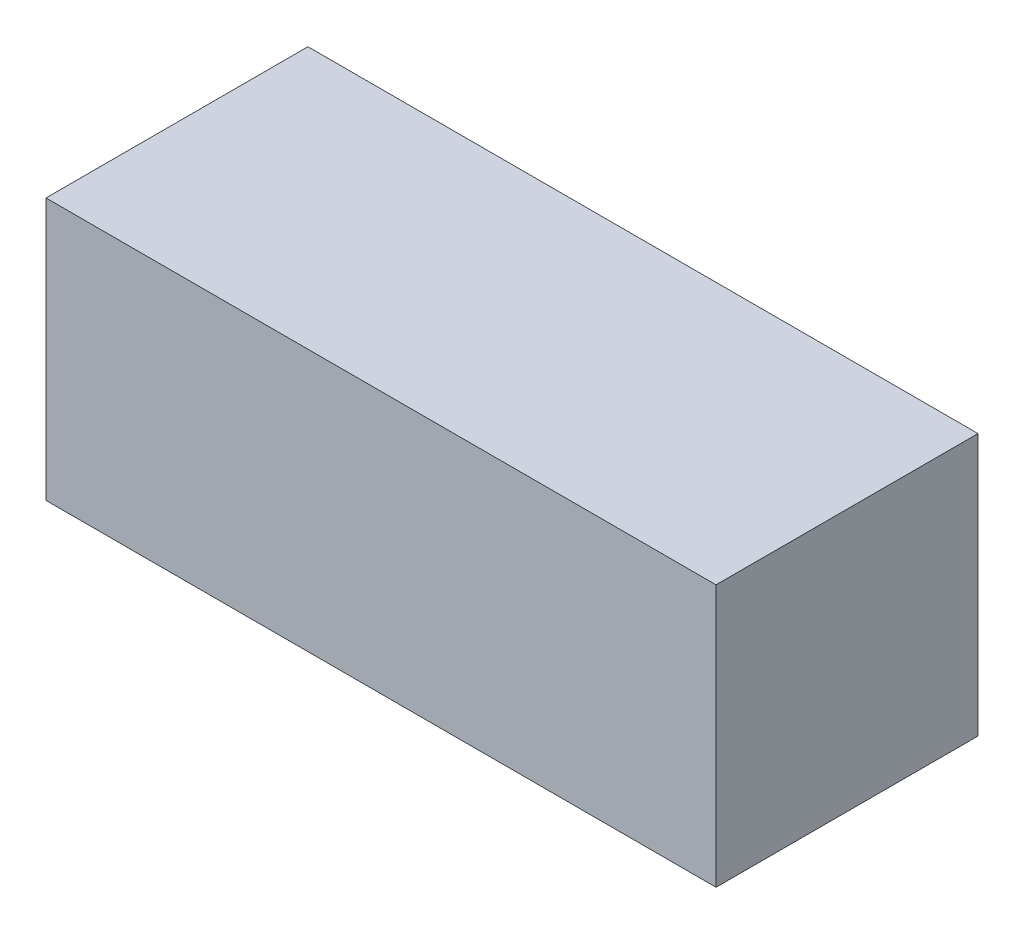
ISO-10303-21;
HEADER;
FILE_DESCRIPTION(('STEP AP214'),'2;1');
FILE_NAME('part.step','',(''),(''),'','','');
FILE_SCHEMA(('AUTOMOTIVE_DESIGN { 1 0 10303 214 1 1 1 1 }'));
ENDSEC;
DATA;
#1=APPLICATION_CONTEXT('core data for automotive mechanical design processes');
#2=APPLICATION_PROTOCOL_DEFINITION('international standard','automotive_design',2000,#1);
#3=PRODUCT_CONTEXT('',#1,'mechanical');
#4=PRODUCT('Part','Part','',(#3));
#5=PRODUCT_RELATED_PRODUCT_CATEGORY('part','',(#4));
#6=PRODUCT_DEFINITION_FORMATION('','',#4);
#7=PRODUCT_DEFINITION_CONTEXT('part definition',#1,'design');
#8=PRODUCT_DEFINITION('design','',#6,#7);
#9=PRODUCT_DEFINITION_SHAPE('','',#8);
#10=(LENGTH_UNIT() NAMED_UNIT(*) SI_UNIT(.MILLI.,.METRE.));
#11=(NAMED_UNIT(*) PLANE_ANGLE_UNIT() SI_UNIT($,.RADIAN.));
#12=(NAMED_UNIT(*) SI_UNIT($,.STERADIAN.) SOLID_ANGLE_UNIT());
#13=UNCERTAINTY_MEASURE_WITH_UNIT(LENGTH_MEASURE(1.E-05),#10,'distance_accuracy_value','');
#14=(GEOMETRIC_REPRESENTATION_CONTEXT(3) GLOBAL_UNCERTAINTY_ASSIGNED_CONTEXT((#13)) GLOBAL_UNIT_ASSIGNED_CONTEXT((#10,
#11,#12)) REPRESENTATION_CONTEXT('',''));
#15=CARTESIAN_POINT('',(0.,0.,0.));
#16=DIRECTION('',(0.,0.,1.));
#17=DIRECTION('',(1.,0.,0.));
#18=AXIS2_PLACEMENT_3D('',#15,#16,#17);
#19=CARTESIAN_POINT('',(-83.2648565355436,-34.174622182638,30.));
#20=DIRECTION('',(1.,0.,0.));
#21=DIRECTION('',(0.,1.,0.));
#22=AXIS2_PLACEMENT_3D('',#19,#20,#21);
#23=PLANE('',#22);
#24=DIRECTION('',(0.,-1.,0.));
#25=VECTOR('',#24,1.);
#26=CARTESIAN_POINT('',(-83.2648565355436,-34.174622182638,0.));
#27=LINE('',#26,#25);
#28=CARTESIAN_POINT('',(-83.2648565355439,-4.17462218263802,0.));
#29=VERTEX_POINT('',#28);
#30=CARTESIAN_POINT('',(-83.2648565355436,-34.174622182638,0.));
#31=VERTEX_POINT('',#30);
#32=EDGE_CURVE('E96',#29,#31,#27,.T.);
#33=ORIENTED_EDGE('',*,*,#32,.T.);
#34=DIRECTION('',(0.,0.,-1.));
#35=VECTOR('',#34,1.);
#36=CARTESIAN_POINT('',(-83.2648565355436,-34.174622182638,30.));
#37=LINE('',#36,#35);
#38=CARTESIAN_POINT('',(-83.2648565355436,-34.174622182638,30.));
#39=VERTEX_POINT('',#38);
#40=EDGE_CURVE('E11',#39,#31,#37,.T.);
#41=ORIENTED_EDGE('',*,*,#40,.F.);
#42=DIRECTION('',(0.,-1.,0.));
#43=VECTOR('',#42,1.);
#44=CARTESIAN_POINT('',(-83.2648565355436,-34.174622182638,30.));
#45=LINE('',#44,#43);
#46=CARTESIAN_POINT('',(-83.2648565355439,-4.17462218263802,30.));
#47=VERTEX_POINT('',#46);
#48=EDGE_CURVE('E84',#47,#39,#45,.T.);
#49=ORIENTED_EDGE('',*,*,#48,.F.);
#50=DIRECTION('',(0.,0.,-1.));
#51=VECTOR('',#50,1.);
#52=CARTESIAN_POINT('',(-83.2648565355439,-4.17462218263802,30.));
#53=LINE('',#52,#51);
#54=EDGE_CURVE('E92',#47,#29,#53,.T.);
#55=ORIENTED_EDGE('',*,*,#54,.T.);
#56=EDGE_LOOP('',(#33,#41,#49,#55));
#57=FACE_BOUND('',#56,.T.);
#58=ADVANCED_FACE('F33',(#57),#23,.F.);
#59=CARTESIAN_POINT('',(-83.2648565355436,-34.174622182638,30.));
#60=DIRECTION('',(0.,1.,0.));
#61=DIRECTION('',(0.,0.,1.));
#62=AXIS2_PLACEMENT_3D('',#59,#60,#61);
#63=PLANE('',#62);
#64=DIRECTION('',(1.,0.,0.));
#65=VECTOR('',#64,1.);
#66=CARTESIAN_POINT('',(-83.2648565355436,-34.174622182638,0.));
#67=LINE('',#66,#65);
#68=CARTESIAN_POINT('',(-6.52925654474992,-34.174622182638,0.));
#69=VERTEX_POINT('',#68);
#70=EDGE_CURVE('E88',#31,#69,#67,.T.);
#71=ORIENTED_EDGE('',*,*,#70,.T.);
#72=DIRECTION('',(0.,0.,-1.));
#73=VECTOR('',#72,1.);
#74=CARTESIAN_POINT('',(-6.52925654474992,-34.174622182638,30.));
#75=LINE('',#74,#73);
#76=CARTESIAN_POINT('',(-6.52925654474992,-34.174622182638,30.));
#77=VERTEX_POINT('',#76);
#78=EDGE_CURVE('E41',#77,#69,#75,.T.);
#79=ORIENTED_EDGE('',*,*,#78,.F.);
#80=DIRECTION('',(1.,0.,0.));
#81=VECTOR('',#80,1.);
#82=CARTESIAN_POINT('',(-83.2648565355436,-34.174622182638,30.));
#83=LINE('',#82,#81);
#84=EDGE_CURVE('E79',#39,#77,#83,.T.);
#85=ORIENTED_EDGE('',*,*,#84,.F.);
#86=ORIENTED_EDGE('',*,*,#40,.T.);
#87=EDGE_LOOP('',(#71,#79,#85,#86));
#88=FACE_BOUND('',#87,.T.);
#89=ADVANCED_FACE('F87',(#88),#63,.F.);
#90=CARTESIAN_POINT('',(-6.52925654474992,-34.174622182638,30.));
#91=DIRECTION('',(-1.,0.,0.));
#92=DIRECTION('',(0.,0.,1.));
#93=AXIS2_PLACEMENT_3D('',#90,#91,#92);
#94=PLANE('',#93);
#95=DIRECTION('',(0.,1.,0.));
#96=VECTOR('',#95,1.);
#97=CARTESIAN_POINT('',(-6.52925654474992,-34.174622182638,0.));
#98=LINE('',#97,#96);
#99=CARTESIAN_POINT('',(-6.52925654474992,-4.17462218263802,0.));
#100=VERTEX_POINT('',#99);
#101=EDGE_CURVE('E66',#69,#100,#98,.T.);
#102=ORIENTED_EDGE('',*,*,#101,.T.);
#103=DIRECTION('',(0.,0.,-1.));
#104=VECTOR('',#103,1.);
#105=CARTESIAN_POINT('',(-6.52925654474992,-4.17462218263802,30.));
#106=LINE('',#105,#104);
#107=CARTESIAN_POINT('',(-6.52925654474992,-4.17462218263802,30.));
#108=VERTEX_POINT('',#107);
#109=EDGE_CURVE('E89',#108,#100,#106,.T.);
#110=ORIENTED_EDGE('',*,*,#109,.F.);
#111=DIRECTION('',(0.,1.,0.));
#112=VECTOR('',#111,1.);
#113=CARTESIAN_POINT('',(-6.52925654474992,-34.174622182638,30.));
#114=LINE('',#113,#112);
#115=EDGE_CURVE('E82',#77,#108,#114,.T.);
#116=ORIENTED_EDGE('',*,*,#115,.F.);
#117=ORIENTED_EDGE('',*,*,#78,.T.);
#118=EDGE_LOOP('',(#102,#110,#116,#117));
#119=FACE_BOUND('',#118,.T.);
#120=ADVANCED_FACE('F90',(#119),#94,.F.);
#121=CARTESIAN_POINT('',(-83.2648565355439,-4.17462218263802,30.));
#122=DIRECTION('',(0.,-1.,0.));
#123=DIRECTION('',(0.,0.,-1.));
#124=AXIS2_PLACEMENT_3D('',#121,#122,#123);
#125=PLANE('',#124);
#126=DIRECTION('',(-1.,0.,0.));
#127=VECTOR('',#126,1.);
#128=CARTESIAN_POINT('',(-83.2648565355439,-4.17462218263802,0.));
#129=LINE('',#128,#127);
#130=EDGE_CURVE('E72',#100,#29,#129,.T.);
#131=ORIENTED_EDGE('',*,*,#130,.T.);
#132=ORIENTED_EDGE('',*,*,#54,.F.);
#133=DIRECTION('',(-1.,0.,0.));
#134=VECTOR('',#133,1.);
#135=CARTESIAN_POINT('',(-83.2648565355439,-4.17462218263802,30.));
#136=LINE('',#135,#134);
#137=EDGE_CURVE('E49',#108,#47,#136,.T.);
#138=ORIENTED_EDGE('',*,*,#137,.F.);
#139=ORIENTED_EDGE('',*,*,#109,.T.);
#140=EDGE_LOOP('',(#131,#132,#138,#139));
#141=FACE_BOUND('',#140,.T.);
#142=ADVANCED_FACE('F103',(#141),#125,.F.);
#143=CARTESIAN_POINT('',(0.,0.,30.));
#144=DIRECTION('',(0.,0.,-1.));
#145=DIRECTION('',(-1.,0.,0.));
#146=AXIS2_PLACEMENT_3D('',#143,#144,#145);
#147=PLANE('',#146);
#148=ORIENTED_EDGE('',*,*,#48,.T.);
#149=ORIENTED_EDGE('',*,*,#84,.T.);
#150=ORIENTED_EDGE('',*,*,#115,.T.);
#151=ORIENTED_EDGE('',*,*,#137,.T.);
#152=EDGE_LOOP('',(#148,#149,#150,#151));
#153=FACE_BOUND('',#152,.T.);
#154=ADVANCED_FACE('F80',(#153),#147,.F.);
#155=CARTESIAN_POINT('',(0.,0.,0.));
#156=DIRECTION('',(0.,0.,-1.));
#157=DIRECTION('',(-1.,0.,0.));
#158=AXIS2_PLACEMENT_3D('',#155,#156,#157);
#159=PLANE('',#158);
#160=ORIENTED_EDGE('',*,*,#32,.F.);
#161=ORIENTED_EDGE('',*,*,#130,.F.);
#162=ORIENTED_EDGE('',*,*,#101,.F.);
#163=ORIENTED_EDGE('',*,*,#70,.F.);
#164=EDGE_LOOP('',(#160,#161,#162,#163));
#165=FACE_BOUND('',#164,.T.);
#166=ADVANCED_FACE('F106',(#165),#159,.T.);
#167=CLOSED_SHELL('',(#58,#89,#120,#142,#154,#166));
#168=MANIFOLD_SOLID_BREP('B2',#167);
#169=ADVANCED_BREP_SHAPE_REPRESENTATION('',(#18,#168),#14);
#170=SHAPE_DEFINITION_REPRESENTATION(#9,#169);
ENDSEC;
END-ISO-10303-21;
